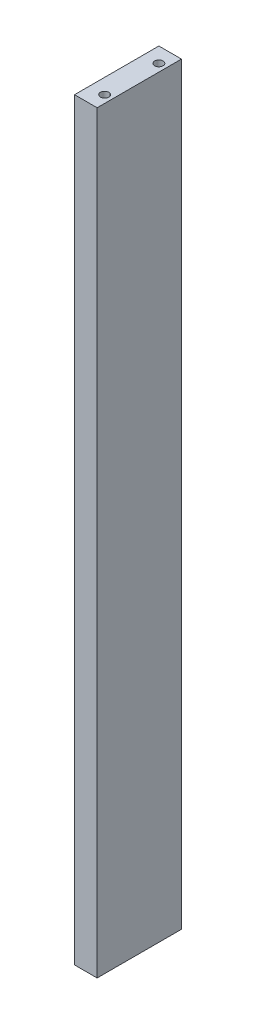
ISO-10303-21;
HEADER;
FILE_DESCRIPTION(('STEP AP214'),'2;1');
FILE_NAME('part.step','',(''),(''),'','','');
FILE_SCHEMA(('AUTOMOTIVE_DESIGN { 1 0 10303 214 1 1 1 1 }'));
ENDSEC;
DATA;
#1=APPLICATION_CONTEXT('core data for automotive mechanical design processes');
#2=APPLICATION_PROTOCOL_DEFINITION('international standard','automotive_design',2000,#1);
#3=PRODUCT_CONTEXT('',#1,'mechanical');
#4=PRODUCT('Part','Part','',(#3));
#5=PRODUCT_RELATED_PRODUCT_CATEGORY('part','',(#4));
#6=PRODUCT_DEFINITION_FORMATION('','',#4);
#7=PRODUCT_DEFINITION_CONTEXT('part definition',#1,'design');
#8=PRODUCT_DEFINITION('design','',#6,#7);
#9=PRODUCT_DEFINITION_SHAPE('','',#8);
#10=(LENGTH_UNIT() NAMED_UNIT(*) SI_UNIT(.MILLI.,.METRE.));
#11=(NAMED_UNIT(*) PLANE_ANGLE_UNIT() SI_UNIT($,.RADIAN.));
#12=(NAMED_UNIT(*) SI_UNIT($,.STERADIAN.) SOLID_ANGLE_UNIT());
#13=UNCERTAINTY_MEASURE_WITH_UNIT(LENGTH_MEASURE(1.E-05),#10,'distance_accuracy_value','');
#14=(GEOMETRIC_REPRESENTATION_CONTEXT(3) GLOBAL_UNCERTAINTY_ASSIGNED_CONTEXT((#13)) GLOBAL_UNIT_ASSIGNED_CONTEXT((#10,
#11,#12)) REPRESENTATION_CONTEXT('',''));
#15=CARTESIAN_POINT('',(0.,0.,0.));
#16=DIRECTION('',(0.,0.,1.));
#17=DIRECTION('',(1.,0.,0.));
#18=AXIS2_PLACEMENT_3D('',#15,#16,#17);
#19=CARTESIAN_POINT('',(0.,250.2,0.));
#20=DIRECTION('',(0.,-1.,0.));
#21=DIRECTION('',(0.,0.,-1.));
#22=AXIS2_PLACEMENT_3D('',#19,#20,#21);
#23=PLANE('',#22);
#24=DIRECTION('',(0.,0.,-1.));
#25=VECTOR('',#24,1.);
#26=CARTESIAN_POINT('',(3.75,250.2,14.));
#27=LINE('',#26,#25);
#28=CARTESIAN_POINT('',(3.75,250.2,14.));
#29=VERTEX_POINT('',#28);
#30=CARTESIAN_POINT('',(3.75,250.2,-14.));
#31=VERTEX_POINT('',#30);
#32=EDGE_CURVE('E220',#29,#31,#27,.T.);
#33=ORIENTED_EDGE('',*,*,#32,.T.);
#34=DIRECTION('',(-1.,0.,0.));
#35=VECTOR('',#34,1.);
#36=CARTESIAN_POINT('',(-3.75,250.2,-14.));
#37=LINE('',#36,#35);
#38=CARTESIAN_POINT('',(-3.75,250.2,-14.));
#39=VERTEX_POINT('',#38);
#40=EDGE_CURVE('E91',#31,#39,#37,.T.);
#41=ORIENTED_EDGE('',*,*,#40,.T.);
#42=DIRECTION('',(0.,0.,1.));
#43=VECTOR('',#42,1.);
#44=CARTESIAN_POINT('',(-3.75,250.2,14.));
#45=LINE('',#44,#43);
#46=CARTESIAN_POINT('',(-3.75,250.2,14.));
#47=VERTEX_POINT('',#46);
#48=EDGE_CURVE('E223',#39,#47,#45,.T.);
#49=ORIENTED_EDGE('',*,*,#48,.T.);
#50=DIRECTION('',(1.,0.,0.));
#51=VECTOR('',#50,1.);
#52=CARTESIAN_POINT('',(-3.75,250.2,14.));
#53=LINE('',#52,#51);
#54=EDGE_CURVE('E63',#47,#29,#53,.T.);
#55=ORIENTED_EDGE('',*,*,#54,.T.);
#56=EDGE_LOOP('',(#33,#41,#49,#55));
#57=FACE_BOUND('',#56,.T.);
#58=CARTESIAN_POINT('',(1.25,250.2,9.));
#59=DIRECTION('',(0.,1.,0.));
#60=DIRECTION('',(0.,0.,1.));
#61=AXIS2_PLACEMENT_3D('',#58,#59,#60);
#62=CIRCLE('',#61,1.4);
#63=CARTESIAN_POINT('',(1.25,250.2,10.4));
#64=VERTEX_POINT('',#63);
#65=EDGE_CURVE('E214',#64,#64,#62,.T.);
#66=ORIENTED_EDGE('',*,*,#65,.F.);
#67=EDGE_LOOP('',(#66));
#68=FACE_BOUND('',#67,.T.);
#69=CARTESIAN_POINT('',(1.25,250.2,-9.));
#70=DIRECTION('',(0.,1.,0.));
#71=DIRECTION('',(0.,0.,1.));
#72=AXIS2_PLACEMENT_3D('',#69,#70,#71);
#73=CIRCLE('',#72,1.4);
#74=CARTESIAN_POINT('',(1.25,250.2,-7.6));
#75=VERTEX_POINT('',#74);
#76=EDGE_CURVE('E208',#75,#75,#73,.T.);
#77=ORIENTED_EDGE('',*,*,#76,.F.);
#78=EDGE_LOOP('',(#77));
#79=FACE_BOUND('',#78,.T.);
#80=ADVANCED_FACE('F39',(#57,#68,#79),#23,.F.);
#81=CARTESIAN_POINT('',(0.,0.,0.));
#82=DIRECTION('',(0.,-1.,0.));
#83=DIRECTION('',(0.,0.,-1.));
#84=AXIS2_PLACEMENT_3D('',#81,#82,#83);
#85=PLANE('',#84);
#86=CARTESIAN_POINT('',(1.25,0.,9.));
#87=DIRECTION('',(0.,1.,0.));
#88=DIRECTION('',(0.,0.,1.));
#89=AXIS2_PLACEMENT_3D('',#86,#87,#88);
#90=CIRCLE('',#89,1.4);
#91=CARTESIAN_POINT('',(1.25,0.,10.4));
#92=VERTEX_POINT('',#91);
#93=EDGE_CURVE('E211',#92,#92,#90,.T.);
#94=ORIENTED_EDGE('',*,*,#93,.T.);
#95=EDGE_LOOP('',(#94));
#96=FACE_BOUND('',#95,.T.);
#97=DIRECTION('',(0.,0.,-1.));
#98=VECTOR('',#97,1.);
#99=CARTESIAN_POINT('',(3.75,0.,14.));
#100=LINE('',#99,#98);
#101=CARTESIAN_POINT('',(3.75,0.,14.));
#102=VERTEX_POINT('',#101);
#103=CARTESIAN_POINT('',(3.75,0.,-14.));
#104=VERTEX_POINT('',#103);
#105=EDGE_CURVE('E217',#102,#104,#100,.T.);
#106=ORIENTED_EDGE('',*,*,#105,.F.);
#107=DIRECTION('',(1.,0.,0.));
#108=VECTOR('',#107,1.);
#109=CARTESIAN_POINT('',(-3.75,0.,14.));
#110=LINE('',#109,#108);
#111=CARTESIAN_POINT('',(-3.75,0.,14.));
#112=VERTEX_POINT('',#111);
#113=EDGE_CURVE('E84',#112,#102,#110,.T.);
#114=ORIENTED_EDGE('',*,*,#113,.F.);
#115=DIRECTION('',(0.,0.,1.));
#116=VECTOR('',#115,1.);
#117=CARTESIAN_POINT('',(-3.75,0.,14.));
#118=LINE('',#117,#116);
#119=CARTESIAN_POINT('',(-3.75,0.,-14.));
#120=VERTEX_POINT('',#119);
#121=EDGE_CURVE('E231',#120,#112,#118,.T.);
#122=ORIENTED_EDGE('',*,*,#121,.F.);
#123=DIRECTION('',(-1.,0.,0.));
#124=VECTOR('',#123,1.);
#125=CARTESIAN_POINT('',(-3.75,0.,-14.));
#126=LINE('',#125,#124);
#127=EDGE_CURVE('E229',#104,#120,#126,.T.);
#128=ORIENTED_EDGE('',*,*,#127,.F.);
#129=EDGE_LOOP('',(#106,#114,#122,#128));
#130=FACE_BOUND('',#129,.T.);
#131=CARTESIAN_POINT('',(1.25,0.,-9.));
#132=DIRECTION('',(0.,1.,0.));
#133=DIRECTION('',(0.,0.,1.));
#134=AXIS2_PLACEMENT_3D('',#131,#132,#133);
#135=CIRCLE('',#134,1.4);
#136=CARTESIAN_POINT('',(1.25,0.,-7.6));
#137=VERTEX_POINT('',#136);
#138=EDGE_CURVE('E196',#137,#137,#135,.T.);
#139=ORIENTED_EDGE('',*,*,#138,.T.);
#140=EDGE_LOOP('',(#139));
#141=FACE_BOUND('',#140,.T.);
#142=ADVANCED_FACE('F244',(#96,#130,#141),#85,.T.);
#143=CARTESIAN_POINT('',(3.75,250.2,14.));
#144=DIRECTION('',(-1.,0.,0.));
#145=DIRECTION('',(0.,0.,1.));
#146=AXIS2_PLACEMENT_3D('',#143,#144,#145);
#147=PLANE('',#146);
#148=ORIENTED_EDGE('',*,*,#105,.T.);
#149=DIRECTION('',(0.,-1.,0.));
#150=VECTOR('',#149,1.);
#151=CARTESIAN_POINT('',(3.75,250.2,-14.));
#152=LINE('',#151,#150);
#153=EDGE_CURVE('E11',#31,#104,#152,.T.);
#154=ORIENTED_EDGE('',*,*,#153,.F.);
#155=ORIENTED_EDGE('',*,*,#32,.F.);
#156=DIRECTION('',(0.,-1.,0.));
#157=VECTOR('',#156,1.);
#158=CARTESIAN_POINT('',(3.75,250.2,14.));
#159=LINE('',#158,#157);
#160=EDGE_CURVE('E226',#29,#102,#159,.T.);
#161=ORIENTED_EDGE('',*,*,#160,.T.);
#162=EDGE_LOOP('',(#148,#154,#155,#161));
#163=FACE_BOUND('',#162,.T.);
#164=ADVANCED_FACE('F41',(#163),#147,.F.);
#165=CARTESIAN_POINT('',(-3.75,250.2,-14.));
#166=DIRECTION('',(0.,0.,1.));
#167=DIRECTION('',(1.,0.,0.));
#168=AXIS2_PLACEMENT_3D('',#165,#166,#167);
#169=PLANE('',#168);
#170=ORIENTED_EDGE('',*,*,#127,.T.);
#171=DIRECTION('',(0.,-1.,0.));
#172=VECTOR('',#171,1.);
#173=CARTESIAN_POINT('',(-3.75,250.2,-14.));
#174=LINE('',#173,#172);
#175=EDGE_CURVE('E47',#39,#120,#174,.T.);
#176=ORIENTED_EDGE('',*,*,#175,.F.);
#177=ORIENTED_EDGE('',*,*,#40,.F.);
#178=ORIENTED_EDGE('',*,*,#153,.T.);
#179=EDGE_LOOP('',(#170,#176,#177,#178));
#180=FACE_BOUND('',#179,.T.);
#181=ADVANCED_FACE('F260',(#180),#169,.F.);
#182=CARTESIAN_POINT('',(-3.75,250.2,14.));
#183=DIRECTION('',(1.,0.,0.));
#184=DIRECTION('',(0.,0.,-1.));
#185=AXIS2_PLACEMENT_3D('',#182,#183,#184);
#186=PLANE('',#185);
#187=DIRECTION('',(0.,-0.984120800511807,-0.1775));
#188=VECTOR('',#187,1.);
#189=CARTESIAN_POINT('',(-3.75,137.36625,-1.47618120076771));
#190=LINE('',#189,#188);
#191=CARTESIAN_POINT('',(-3.75,137.36625,-1.47618120076771));
#192=VERTEX_POINT('',#191);
#193=CARTESIAN_POINT('',(-3.75,125.744325,-3.57235850585786));
#194=VERTEX_POINT('',#193);
#195=EDGE_CURVE('E178',#192,#194,#190,.T.);
#196=ORIENTED_EDGE('',*,*,#195,.F.);
#197=CARTESIAN_POINT('',(-3.75,137.1,0.));
#198=DIRECTION('',(-1.,0.,0.));
#199=DIRECTION('',(0.,0.,1.));
#200=AXIS2_PLACEMENT_3D('',#197,#198,#199);
#201=CIRCLE('',#200,1.5);
#202=CARTESIAN_POINT('',(-3.75,137.36625,1.47618120076771));
#203=VERTEX_POINT('',#202);
#204=EDGE_CURVE('E54',#203,#192,#201,.T.);
#205=ORIENTED_EDGE('',*,*,#204,.F.);
#206=DIRECTION('',(0.,0.984120800511807,-0.1775));
#207=VECTOR('',#206,1.);
#208=CARTESIAN_POINT('',(-3.75,137.36625,1.47618120076771));
#209=LINE('',#208,#207);
#210=CARTESIAN_POINT('',(-3.75,125.744325,3.57235850585786));
#211=VERTEX_POINT('',#210);
#212=EDGE_CURVE('E158',#211,#203,#209,.T.);
#213=ORIENTED_EDGE('',*,*,#212,.F.);
#214=CARTESIAN_POINT('',(-3.75,125.1,0.));
#215=DIRECTION('',(-1.,0.,0.));
#216=DIRECTION('',(0.,0.,1.));
#217=AXIS2_PLACEMENT_3D('',#214,#215,#216);
#218=CIRCLE('',#217,3.63);
#219=CARTESIAN_POINT('',(-3.75,124.455675,3.57235850585786));
#220=VERTEX_POINT('',#219);
#221=EDGE_CURVE('E161',#220,#211,#218,.T.);
#222=ORIENTED_EDGE('',*,*,#221,.F.);
#223=DIRECTION('',(0.,0.984120800511807,0.1775));
#224=VECTOR('',#223,1.);
#225=CARTESIAN_POINT('',(-3.75,124.455675,3.57235850585786));
#226=LINE('',#225,#224);
#227=CARTESIAN_POINT('',(-3.75,112.83375,1.47618120076771));
#228=VERTEX_POINT('',#227);
#229=EDGE_CURVE('E189',#228,#220,#226,.T.);
#230=ORIENTED_EDGE('',*,*,#229,.F.);
#231=CARTESIAN_POINT('',(-3.75,113.1,0.));
#232=DIRECTION('',(-1.,0.,0.));
#233=DIRECTION('',(0.,0.,1.));
#234=AXIS2_PLACEMENT_3D('',#231,#232,#233);
#235=CIRCLE('',#234,1.5);
#236=CARTESIAN_POINT('',(-3.75,112.83375,-1.47618120076771));
#237=VERTEX_POINT('',#236);
#238=EDGE_CURVE('E186',#237,#228,#235,.T.);
#239=ORIENTED_EDGE('',*,*,#238,.F.);
#240=DIRECTION('',(0.,-0.984120800511807,0.1775));
#241=VECTOR('',#240,1.);
#242=CARTESIAN_POINT('',(-3.75,124.455675,-3.57235850585786));
#243=LINE('',#242,#241);
#244=CARTESIAN_POINT('',(-3.75,124.455675,-3.57235850585786));
#245=VERTEX_POINT('',#244);
#246=EDGE_CURVE('E183',#245,#237,#243,.T.);
#247=ORIENTED_EDGE('',*,*,#246,.F.);
#248=CARTESIAN_POINT('',(-3.75,125.1,0.));
#249=DIRECTION('',(-1.,0.,0.));
#250=DIRECTION('',(0.,0.,1.));
#251=AXIS2_PLACEMENT_3D('',#248,#249,#250);
#252=CIRCLE('',#251,3.63);
#253=EDGE_CURVE('E180',#194,#245,#252,.T.);
#254=ORIENTED_EDGE('',*,*,#253,.F.);
#255=EDGE_LOOP('',(#196,#205,#213,#222,#230,#239,#247,#254));
#256=FACE_BOUND('',#255,.T.);
#257=ORIENTED_EDGE('',*,*,#121,.T.);
#258=DIRECTION('',(0.,-1.,0.));
#259=VECTOR('',#258,1.);
#260=CARTESIAN_POINT('',(-3.75,250.2,14.));
#261=LINE('',#260,#259);
#262=EDGE_CURVE('E235',#47,#112,#261,.T.);
#263=ORIENTED_EDGE('',*,*,#262,.F.);
#264=ORIENTED_EDGE('',*,*,#48,.F.);
#265=ORIENTED_EDGE('',*,*,#175,.T.);
#266=EDGE_LOOP('',(#257,#263,#264,#265));
#267=FACE_BOUND('',#266,.T.);
#268=ADVANCED_FACE('F240',(#256,#267),#186,.F.);
#269=CARTESIAN_POINT('',(-3.75,250.2,14.));
#270=DIRECTION('',(0.,0.,-1.));
#271=DIRECTION('',(-1.,0.,0.));
#272=AXIS2_PLACEMENT_3D('',#269,#270,#271);
#273=PLANE('',#272);
#274=ORIENTED_EDGE('',*,*,#113,.T.);
#275=ORIENTED_EDGE('',*,*,#160,.F.);
#276=ORIENTED_EDGE('',*,*,#54,.F.);
#277=ORIENTED_EDGE('',*,*,#262,.T.);
#278=EDGE_LOOP('',(#274,#275,#276,#277));
#279=FACE_BOUND('',#278,.T.);
#280=ADVANCED_FACE('F249',(#279),#273,.F.);
#281=CARTESIAN_POINT('',(1.25,250.2,9.));
#282=DIRECTION('',(0.,-1.,0.));
#283=DIRECTION('',(0.,0.,-1.));
#284=AXIS2_PLACEMENT_3D('',#281,#282,#283);
#285=CYLINDRICAL_SURFACE('',#284,1.4);
#286=ORIENTED_EDGE('',*,*,#65,.T.);
#287=EDGE_LOOP('',(#286));
#288=FACE_BOUND('',#287,.T.);
#289=ORIENTED_EDGE('',*,*,#93,.F.);
#290=EDGE_LOOP('',(#289));
#291=FACE_BOUND('',#290,.T.);
#292=ADVANCED_FACE('F251',(#288,#291),#285,.F.);
#293=CARTESIAN_POINT('',(1.25,250.2,-9.));
#294=DIRECTION('',(0.,-1.,0.));
#295=DIRECTION('',(0.,0.,-1.));
#296=AXIS2_PLACEMENT_3D('',#293,#294,#295);
#297=CYLINDRICAL_SURFACE('',#296,1.4);
#298=ORIENTED_EDGE('',*,*,#76,.T.);
#299=EDGE_LOOP('',(#298));
#300=FACE_BOUND('',#299,.T.);
#301=ORIENTED_EDGE('',*,*,#138,.F.);
#302=EDGE_LOOP('',(#301));
#303=FACE_BOUND('',#302,.T.);
#304=ADVANCED_FACE('F257',(#300,#303),#297,.F.);
#305=CARTESIAN_POINT('',(-1.75,137.1,0.));
#306=DIRECTION('',(-1.,0.,0.));
#307=DIRECTION('',(0.,0.,1.));
#308=AXIS2_PLACEMENT_3D('',#305,#306,#307);
#309=CYLINDRICAL_SURFACE('',#308,1.5);
#310=ORIENTED_EDGE('',*,*,#204,.T.);
#311=DIRECTION('',(-1.,0.,0.));
#312=VECTOR('',#311,1.);
#313=CARTESIAN_POINT('',(-1.75,137.36625,-1.47618120076771));
#314=LINE('',#313,#312);
#315=CARTESIAN_POINT('',(-1.75,137.36625,-1.47618120076771));
#316=VERTEX_POINT('',#315);
#317=EDGE_CURVE('E135',#316,#192,#314,.T.);
#318=ORIENTED_EDGE('',*,*,#317,.F.);
#319=CARTESIAN_POINT('',(-1.75,137.1,0.));
#320=DIRECTION('',(-1.,0.,0.));
#321=DIRECTION('',(0.,0.,1.));
#322=AXIS2_PLACEMENT_3D('',#319,#320,#321);
#323=CIRCLE('',#322,1.5);
#324=CARTESIAN_POINT('',(-1.75,137.36625,1.47618120076771));
#325=VERTEX_POINT('',#324);
#326=EDGE_CURVE('E139',#325,#316,#323,.T.);
#327=ORIENTED_EDGE('',*,*,#326,.F.);
#328=DIRECTION('',(-1.,0.,0.));
#329=VECTOR('',#328,1.);
#330=CARTESIAN_POINT('',(-1.75,137.36625,1.47618120076771));
#331=LINE('',#330,#329);
#332=EDGE_CURVE('E194',#325,#203,#331,.T.);
#333=ORIENTED_EDGE('',*,*,#332,.T.);
#334=EDGE_LOOP('',(#310,#318,#327,#333));
#335=FACE_BOUND('',#334,.T.);
#336=ADVANCED_FACE('F137',(#335),#309,.F.);
#337=CARTESIAN_POINT('',(-1.75,137.36625,1.47618120076771));
#338=DIRECTION('',(0.,0.1775,0.984120800511807));
#339=DIRECTION('',(0.,-0.984120800511807,0.1775));
#340=AXIS2_PLACEMENT_3D('',#337,#338,#339);
#341=PLANE('',#340);
#342=ORIENTED_EDGE('',*,*,#212,.T.);
#343=ORIENTED_EDGE('',*,*,#332,.F.);
#344=DIRECTION('',(0.,0.984120800511807,-0.1775));
#345=VECTOR('',#344,1.);
#346=CARTESIAN_POINT('',(-1.75,137.36625,1.47618120076771));
#347=LINE('',#346,#345);
#348=CARTESIAN_POINT('',(-1.75,125.744325,3.57235850585786));
#349=VERTEX_POINT('',#348);
#350=EDGE_CURVE('E145',#349,#325,#347,.T.);
#351=ORIENTED_EDGE('',*,*,#350,.F.);
#352=DIRECTION('',(-1.,0.,0.));
#353=VECTOR('',#352,1.);
#354=CARTESIAN_POINT('',(-1.75,125.744325,3.57235850585786));
#355=LINE('',#354,#353);
#356=EDGE_CURVE('E197',#349,#211,#355,.T.);
#357=ORIENTED_EDGE('',*,*,#356,.T.);
#358=EDGE_LOOP('',(#342,#343,#351,#357));
#359=FACE_BOUND('',#358,.T.);
#360=ADVANCED_FACE('F277',(#359),#341,.F.);
#361=CARTESIAN_POINT('',(-1.75,125.1,0.));
#362=DIRECTION('',(-1.,0.,0.));
#363=DIRECTION('',(0.,0.,1.));
#364=AXIS2_PLACEMENT_3D('',#361,#362,#363);
#365=CYLINDRICAL_SURFACE('',#364,3.63);
#366=ORIENTED_EDGE('',*,*,#221,.T.);
#367=ORIENTED_EDGE('',*,*,#356,.F.);
#368=CARTESIAN_POINT('',(-1.75,125.1,0.));
#369=DIRECTION('',(-1.,0.,0.));
#370=DIRECTION('',(0.,0.,1.));
#371=AXIS2_PLACEMENT_3D('',#368,#369,#370);
#372=CIRCLE('',#371,3.63);
#373=CARTESIAN_POINT('',(-1.75,124.455675,3.57235850585786));
#374=VERTEX_POINT('',#373);
#375=EDGE_CURVE('E174',#374,#349,#372,.T.);
#376=ORIENTED_EDGE('',*,*,#375,.F.);
#377=DIRECTION('',(-1.,0.,0.));
#378=VECTOR('',#377,1.);
#379=CARTESIAN_POINT('',(-1.75,124.455675,3.57235850585786));
#380=LINE('',#379,#378);
#381=EDGE_CURVE('E199',#374,#220,#380,.T.);
#382=ORIENTED_EDGE('',*,*,#381,.T.);
#383=EDGE_LOOP('',(#366,#367,#376,#382));
#384=FACE_BOUND('',#383,.T.);
#385=ADVANCED_FACE('F295',(#384),#365,.F.);
#386=CARTESIAN_POINT('',(-1.75,124.455675,3.57235850585786));
#387=DIRECTION('',(0.,-0.1775,0.984120800511807));
#388=DIRECTION('',(0.,-0.984120800511807,-0.1775));
#389=AXIS2_PLACEMENT_3D('',#386,#387,#388);
#390=PLANE('',#389);
#391=ORIENTED_EDGE('',*,*,#229,.T.);
#392=ORIENTED_EDGE('',*,*,#381,.F.);
#393=DIRECTION('',(0.,0.984120800511807,0.1775));
#394=VECTOR('',#393,1.);
#395=CARTESIAN_POINT('',(-1.75,124.455675,3.57235850585786));
#396=LINE('',#395,#394);
#397=CARTESIAN_POINT('',(-1.75,112.83375,1.47618120076771));
#398=VERTEX_POINT('',#397);
#399=EDGE_CURVE('E171',#398,#374,#396,.T.);
#400=ORIENTED_EDGE('',*,*,#399,.F.);
#401=DIRECTION('',(-1.,0.,0.));
#402=VECTOR('',#401,1.);
#403=CARTESIAN_POINT('',(-1.75,112.83375,1.47618120076771));
#404=LINE('',#403,#402);
#405=EDGE_CURVE('E201',#398,#228,#404,.T.);
#406=ORIENTED_EDGE('',*,*,#405,.T.);
#407=EDGE_LOOP('',(#391,#392,#400,#406));
#408=FACE_BOUND('',#407,.T.);
#409=ADVANCED_FACE('F291',(#408),#390,.F.);
#410=CARTESIAN_POINT('',(-1.75,113.1,0.));
#411=DIRECTION('',(-1.,0.,0.));
#412=DIRECTION('',(0.,0.,1.));
#413=AXIS2_PLACEMENT_3D('',#410,#411,#412);
#414=CYLINDRICAL_SURFACE('',#413,1.5);
#415=ORIENTED_EDGE('',*,*,#238,.T.);
#416=ORIENTED_EDGE('',*,*,#405,.F.);
#417=CARTESIAN_POINT('',(-1.75,113.1,0.));
#418=DIRECTION('',(-1.,0.,0.));
#419=DIRECTION('',(0.,0.,1.));
#420=AXIS2_PLACEMENT_3D('',#417,#418,#419);
#421=CIRCLE('',#420,1.5);
#422=CARTESIAN_POINT('',(-1.75,112.83375,-1.47618120076771));
#423=VERTEX_POINT('',#422);
#424=EDGE_CURVE('E168',#423,#398,#421,.T.);
#425=ORIENTED_EDGE('',*,*,#424,.F.);
#426=DIRECTION('',(-1.,0.,0.));
#427=VECTOR('',#426,1.);
#428=CARTESIAN_POINT('',(-1.75,112.83375,-1.47618120076771));
#429=LINE('',#428,#427);
#430=EDGE_CURVE('E203',#423,#237,#429,.T.);
#431=ORIENTED_EDGE('',*,*,#430,.T.);
#432=EDGE_LOOP('',(#415,#416,#425,#431));
#433=FACE_BOUND('',#432,.T.);
#434=ADVANCED_FACE('F287',(#433),#414,.F.);
#435=CARTESIAN_POINT('',(-1.75,124.455675,-3.57235850585786));
#436=DIRECTION('',(0.,-0.1775,-0.984120800511807));
#437=DIRECTION('',(0.,0.984120800511807,-0.1775));
#438=AXIS2_PLACEMENT_3D('',#435,#436,#437);
#439=PLANE('',#438);
#440=ORIENTED_EDGE('',*,*,#246,.T.);
#441=ORIENTED_EDGE('',*,*,#430,.F.);
#442=DIRECTION('',(0.,-0.984120800511807,0.1775));
#443=VECTOR('',#442,1.);
#444=CARTESIAN_POINT('',(-1.75,124.455675,-3.57235850585786));
#445=LINE('',#444,#443);
#446=CARTESIAN_POINT('',(-1.75,124.455675,-3.57235850585786));
#447=VERTEX_POINT('',#446);
#448=EDGE_CURVE('E165',#447,#423,#445,.T.);
#449=ORIENTED_EDGE('',*,*,#448,.F.);
#450=DIRECTION('',(-1.,0.,0.));
#451=VECTOR('',#450,1.);
#452=CARTESIAN_POINT('',(-1.75,124.455675,-3.57235850585786));
#453=LINE('',#452,#451);
#454=EDGE_CURVE('E205',#447,#245,#453,.T.);
#455=ORIENTED_EDGE('',*,*,#454,.T.);
#456=EDGE_LOOP('',(#440,#441,#449,#455));
#457=FACE_BOUND('',#456,.T.);
#458=ADVANCED_FACE('F283',(#457),#439,.F.);
#459=CARTESIAN_POINT('',(-1.75,125.1,0.));
#460=DIRECTION('',(-1.,0.,0.));
#461=DIRECTION('',(0.,0.,1.));
#462=AXIS2_PLACEMENT_3D('',#459,#460,#461);
#463=CYLINDRICAL_SURFACE('',#462,3.63);
#464=ORIENTED_EDGE('',*,*,#253,.T.);
#465=ORIENTED_EDGE('',*,*,#454,.F.);
#466=CARTESIAN_POINT('',(-1.75,125.1,0.));
#467=DIRECTION('',(-1.,0.,0.));
#468=DIRECTION('',(0.,0.,1.));
#469=AXIS2_PLACEMENT_3D('',#466,#467,#468);
#470=CIRCLE('',#469,3.63);
#471=CARTESIAN_POINT('',(-1.75,125.744325,-3.57235850585786));
#472=VERTEX_POINT('',#471);
#473=EDGE_CURVE('E153',#472,#447,#470,.T.);
#474=ORIENTED_EDGE('',*,*,#473,.F.);
#475=DIRECTION('',(-1.,0.,0.));
#476=VECTOR('',#475,1.);
#477=CARTESIAN_POINT('',(-1.75,125.744325,-3.57235850585786));
#478=LINE('',#477,#476);
#479=EDGE_CURVE('E144',#472,#194,#478,.T.);
#480=ORIENTED_EDGE('',*,*,#479,.T.);
#481=EDGE_LOOP('',(#464,#465,#474,#480));
#482=FACE_BOUND('',#481,.T.);
#483=ADVANCED_FACE('F280',(#482),#463,.F.);
#484=CARTESIAN_POINT('',(-1.75,137.36625,-1.47618120076771));
#485=DIRECTION('',(0.,0.1775,-0.984120800511807));
#486=DIRECTION('',(0.,0.984120800511807,0.1775));
#487=AXIS2_PLACEMENT_3D('',#484,#485,#486);
#488=PLANE('',#487);
#489=ORIENTED_EDGE('',*,*,#195,.T.);
#490=ORIENTED_EDGE('',*,*,#479,.F.);
#491=DIRECTION('',(0.,-0.984120800511807,-0.1775));
#492=VECTOR('',#491,1.);
#493=CARTESIAN_POINT('',(-1.75,137.36625,-1.47618120076771));
#494=LINE('',#493,#492);
#495=EDGE_CURVE('E148',#316,#472,#494,.T.);
#496=ORIENTED_EDGE('',*,*,#495,.F.);
#497=ORIENTED_EDGE('',*,*,#317,.T.);
#498=EDGE_LOOP('',(#489,#490,#496,#497));
#499=FACE_BOUND('',#498,.T.);
#500=ADVANCED_FACE('F149',(#499),#488,.F.);
#501=CARTESIAN_POINT('',(-1.75,137.1,0.));
#502=DIRECTION('',(-1.,0.,0.));
#503=DIRECTION('',(0.,0.,1.));
#504=AXIS2_PLACEMENT_3D('',#501,#502,#503);
#505=PLANE('',#504);
#506=ORIENTED_EDGE('',*,*,#326,.T.);
#507=ORIENTED_EDGE('',*,*,#495,.T.);
#508=ORIENTED_EDGE('',*,*,#473,.T.);
#509=ORIENTED_EDGE('',*,*,#448,.T.);
#510=ORIENTED_EDGE('',*,*,#424,.T.);
#511=ORIENTED_EDGE('',*,*,#399,.T.);
#512=ORIENTED_EDGE('',*,*,#375,.T.);
#513=ORIENTED_EDGE('',*,*,#350,.T.);
#514=EDGE_LOOP('',(#506,#507,#508,#509,#510,#511,#512,#513));
#515=FACE_BOUND('',#514,.T.);
#516=ADVANCED_FACE('F155',(#515),#505,.T.);
#517=CLOSED_SHELL('',(#80,#142,#164,#181,#268,#280,#292,#304,#336,#360,#385,#409,#434,#458,#483,
#500,#516));
#518=MANIFOLD_SOLID_BREP('B2',#517);
#519=ADVANCED_BREP_SHAPE_REPRESENTATION('',(#18,#518),#14);
#520=SHAPE_DEFINITION_REPRESENTATION(#9,#519);
ENDSEC;
END-ISO-10303-21;
